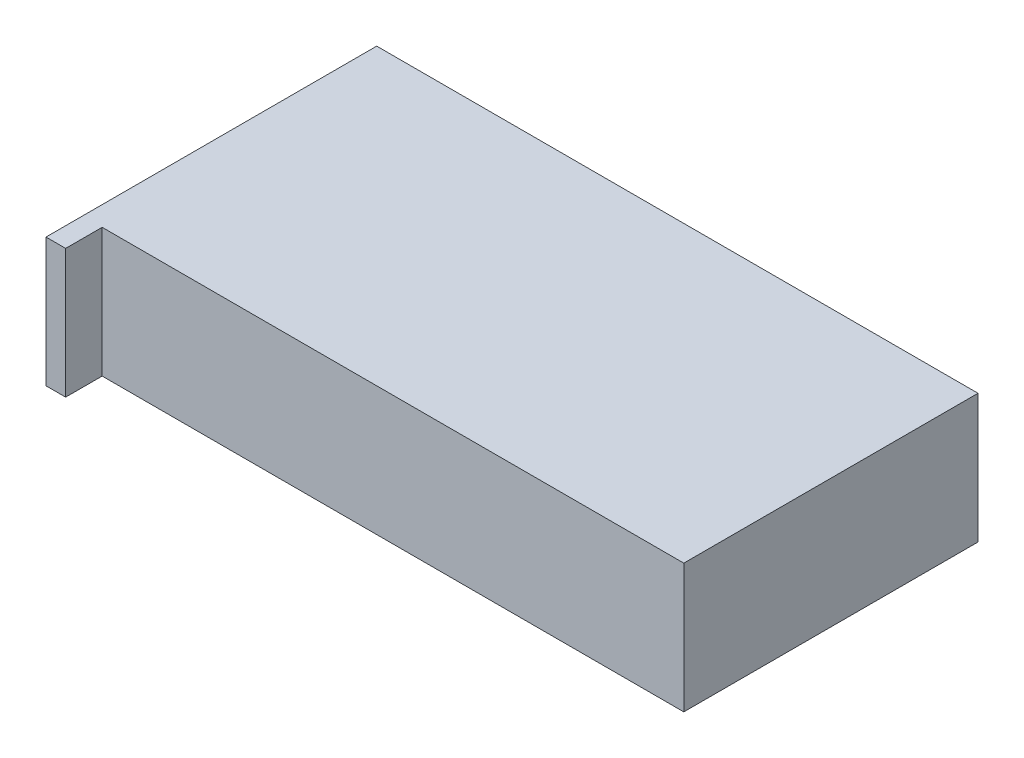
ISO-10303-21;
HEADER;
FILE_DESCRIPTION(('STEP AP214'),'2;1');
FILE_NAME('part.step','',(''),(''),'','','');
FILE_SCHEMA(('AUTOMOTIVE_DESIGN { 1 0 10303 214 1 1 1 1 }'));
ENDSEC;
DATA;
#1=APPLICATION_CONTEXT('core data for automotive mechanical design processes');
#2=APPLICATION_PROTOCOL_DEFINITION('international standard','automotive_design',2000,#1);
#3=PRODUCT_CONTEXT('',#1,'mechanical');
#4=PRODUCT('Part','Part','',(#3));
#5=PRODUCT_RELATED_PRODUCT_CATEGORY('part','',(#4));
#6=PRODUCT_DEFINITION_FORMATION('','',#4);
#7=PRODUCT_DEFINITION_CONTEXT('part definition',#1,'design');
#8=PRODUCT_DEFINITION('design','',#6,#7);
#9=PRODUCT_DEFINITION_SHAPE('','',#8);
#10=(LENGTH_UNIT() NAMED_UNIT(*) SI_UNIT(.MILLI.,.METRE.));
#11=(NAMED_UNIT(*) PLANE_ANGLE_UNIT() SI_UNIT($,.RADIAN.));
#12=(NAMED_UNIT(*) SI_UNIT($,.STERADIAN.) SOLID_ANGLE_UNIT());
#13=UNCERTAINTY_MEASURE_WITH_UNIT(LENGTH_MEASURE(1.E-05),#10,'distance_accuracy_value','');
#14=(GEOMETRIC_REPRESENTATION_CONTEXT(3) GLOBAL_UNCERTAINTY_ASSIGNED_CONTEXT((#13)) GLOBAL_UNIT_ASSIGNED_CONTEXT((#10,
#11,#12)) REPRESENTATION_CONTEXT('',''));
#15=CARTESIAN_POINT('',(0.,0.,0.));
#16=DIRECTION('',(0.,0.,1.));
#17=DIRECTION('',(1.,0.,0.));
#18=AXIS2_PLACEMENT_3D('',#15,#16,#17);
#19=CARTESIAN_POINT('',(0.,15.24,0.));
#20=DIRECTION('',(0.,0.,-1.));
#21=DIRECTION('',(-1.,0.,0.));
#22=AXIS2_PLACEMENT_3D('',#19,#20,#21);
#23=PLANE('',#22);
#24=DIRECTION('',(0.,1.,0.));
#25=VECTOR('',#24,1.);
#26=CARTESIAN_POINT('',(2.32433983399926,15.24,0.));
#27=LINE('',#26,#25);
#28=CARTESIAN_POINT('',(2.32433983399926,0.,0.));
#29=VERTEX_POINT('',#28);
#30=CARTESIAN_POINT('',(2.32433983399926,15.24,0.));
#31=VERTEX_POINT('',#30);
#32=EDGE_CURVE('E49',#29,#31,#27,.T.);
#33=ORIENTED_EDGE('',*,*,#32,.F.);
#34=DIRECTION('',(1.,0.,0.));
#35=VECTOR('',#34,1.);
#36=CARTESIAN_POINT('',(0.,0.,0.));
#37=LINE('',#36,#35);
#38=CARTESIAN_POINT('',(71.12,0.,0.));
#39=VERTEX_POINT('',#38);
#40=EDGE_CURVE('E102',#29,#39,#37,.T.);
#41=ORIENTED_EDGE('',*,*,#40,.T.);
#42=DIRECTION('',(0.,-1.,0.));
#43=VECTOR('',#42,1.);
#44=CARTESIAN_POINT('',(71.12,15.24,0.));
#45=LINE('',#44,#43);
#46=CARTESIAN_POINT('',(71.12,15.24,0.));
#47=VERTEX_POINT('',#46);
#48=EDGE_CURVE('E11',#47,#39,#45,.T.);
#49=ORIENTED_EDGE('',*,*,#48,.F.);
#50=DIRECTION('',(1.,0.,0.));
#51=VECTOR('',#50,1.);
#52=CARTESIAN_POINT('',(0.,15.24,0.));
#53=LINE('',#52,#51);
#54=EDGE_CURVE('E78',#31,#47,#53,.T.);
#55=ORIENTED_EDGE('',*,*,#54,.F.);
#56=EDGE_LOOP('',(#33,#41,#49,#55));
#57=FACE_BOUND('',#56,.T.);
#58=ADVANCED_FACE('F34',(#57),#23,.F.);
#59=CARTESIAN_POINT('',(0.,15.24,0.));
#60=DIRECTION('',(1.,0.,0.));
#61=DIRECTION('',(0.,0.,-1.));
#62=AXIS2_PLACEMENT_3D('',#59,#60,#61);
#63=PLANE('',#62);
#64=DIRECTION('',(0.,0.,1.));
#65=VECTOR('',#64,1.);
#66=CARTESIAN_POINT('',(0.,0.,0.));
#67=LINE('',#66,#65);
#68=CARTESIAN_POINT('',(0.,0.,-34.798));
#69=VERTEX_POINT('',#68);
#70=CARTESIAN_POINT('',(0.,0.,4.31799999999999));
#71=VERTEX_POINT('',#70);
#72=EDGE_CURVE('E95',#69,#71,#67,.T.);
#73=ORIENTED_EDGE('',*,*,#72,.T.);
#74=DIRECTION('',(0.,-1.,0.));
#75=VECTOR('',#74,1.);
#76=CARTESIAN_POINT('',(0.,15.24,4.31799999999999));
#77=LINE('',#76,#75);
#78=CARTESIAN_POINT('',(0.,15.24,4.31799999999999));
#79=VERTEX_POINT('',#78);
#80=EDGE_CURVE('E99',#79,#71,#77,.T.);
#81=ORIENTED_EDGE('',*,*,#80,.F.);
#82=DIRECTION('',(0.,0.,1.));
#83=VECTOR('',#82,1.);
#84=CARTESIAN_POINT('',(0.,15.24,0.));
#85=LINE('',#84,#83);
#86=CARTESIAN_POINT('',(0.,15.24,-34.798));
#87=VERTEX_POINT('',#86);
#88=EDGE_CURVE('E125',#87,#79,#85,.T.);
#89=ORIENTED_EDGE('',*,*,#88,.F.);
#90=DIRECTION('',(0.,-1.,0.));
#91=VECTOR('',#90,1.);
#92=CARTESIAN_POINT('',(0.,15.24,-34.798));
#93=LINE('',#92,#91);
#94=EDGE_CURVE('E100',#87,#69,#93,.T.);
#95=ORIENTED_EDGE('',*,*,#94,.T.);
#96=EDGE_LOOP('',(#73,#81,#89,#95));
#97=FACE_BOUND('',#96,.T.);
#98=ADVANCED_FACE('F36',(#97),#63,.F.);
#99=CARTESIAN_POINT('',(71.12,15.24,0.));
#100=DIRECTION('',(-1.,0.,0.));
#101=DIRECTION('',(0.,0.,1.));
#102=AXIS2_PLACEMENT_3D('',#99,#100,#101);
#103=PLANE('',#102);
#104=DIRECTION('',(0.,0.,-1.));
#105=VECTOR('',#104,1.);
#106=CARTESIAN_POINT('',(71.12,0.,0.));
#107=LINE('',#106,#105);
#108=CARTESIAN_POINT('',(71.12,0.,-34.798));
#109=VERTEX_POINT('',#108);
#110=EDGE_CURVE('E132',#39,#109,#107,.T.);
#111=ORIENTED_EDGE('',*,*,#110,.T.);
#112=DIRECTION('',(0.,-1.,0.));
#113=VECTOR('',#112,1.);
#114=CARTESIAN_POINT('',(71.12,15.24,-34.798));
#115=LINE('',#114,#113);
#116=CARTESIAN_POINT('',(71.12,15.24,-34.798));
#117=VERTEX_POINT('',#116);
#118=EDGE_CURVE('E42',#117,#109,#115,.T.);
#119=ORIENTED_EDGE('',*,*,#118,.F.);
#120=DIRECTION('',(0.,0.,-1.));
#121=VECTOR('',#120,1.);
#122=CARTESIAN_POINT('',(71.12,15.24,0.));
#123=LINE('',#122,#121);
#124=EDGE_CURVE('E128',#47,#117,#123,.T.);
#125=ORIENTED_EDGE('',*,*,#124,.F.);
#126=ORIENTED_EDGE('',*,*,#48,.T.);
#127=EDGE_LOOP('',(#111,#119,#125,#126));
#128=FACE_BOUND('',#127,.T.);
#129=ADVANCED_FACE('F140',(#128),#103,.F.);
#130=CARTESIAN_POINT('',(0.,15.24,-34.798));
#131=DIRECTION('',(0.,0.,1.));
#132=DIRECTION('',(1.,0.,0.));
#133=AXIS2_PLACEMENT_3D('',#130,#131,#132);
#134=PLANE('',#133);
#135=DIRECTION('',(-1.,0.,0.));
#136=VECTOR('',#135,1.);
#137=CARTESIAN_POINT('',(0.,0.,-34.798));
#138=LINE('',#137,#136);
#139=EDGE_CURVE('E74',#109,#69,#138,.T.);
#140=ORIENTED_EDGE('',*,*,#139,.T.);
#141=ORIENTED_EDGE('',*,*,#94,.F.);
#142=DIRECTION('',(-1.,0.,0.));
#143=VECTOR('',#142,1.);
#144=CARTESIAN_POINT('',(0.,15.24,-34.798));
#145=LINE('',#144,#143);
#146=EDGE_CURVE('E58',#117,#87,#145,.T.);
#147=ORIENTED_EDGE('',*,*,#146,.F.);
#148=ORIENTED_EDGE('',*,*,#118,.T.);
#149=EDGE_LOOP('',(#140,#141,#147,#148));
#150=FACE_BOUND('',#149,.T.);
#151=ADVANCED_FACE('F136',(#150),#134,.F.);
#152=CARTESIAN_POINT('',(0.,15.24,0.));
#153=DIRECTION('',(0.,-1.,0.));
#154=DIRECTION('',(0.,0.,-1.));
#155=AXIS2_PLACEMENT_3D('',#152,#153,#154);
#156=PLANE('',#155);
#157=ORIENTED_EDGE('',*,*,#88,.T.);
#158=DIRECTION('',(-1.,0.,0.));
#159=VECTOR('',#158,1.);
#160=CARTESIAN_POINT('',(0.,15.24,4.31799999999999));
#161=LINE('',#160,#159);
#162=CARTESIAN_POINT('',(2.32433983399926,15.24,4.31799999999999));
#163=VERTEX_POINT('',#162);
#164=EDGE_CURVE('E116',#163,#79,#161,.T.);
#165=ORIENTED_EDGE('',*,*,#164,.F.);
#166=DIRECTION('',(0.,0.,-1.));
#167=VECTOR('',#166,1.);
#168=CARTESIAN_POINT('',(2.32433983399926,15.24,4.31799999999999));
#169=LINE('',#168,#167);
#170=EDGE_CURVE('E121',#163,#31,#169,.T.);
#171=ORIENTED_EDGE('',*,*,#170,.T.);
#172=ORIENTED_EDGE('',*,*,#54,.T.);
#173=ORIENTED_EDGE('',*,*,#124,.T.);
#174=ORIENTED_EDGE('',*,*,#146,.T.);
#175=EDGE_LOOP('',(#157,#165,#171,#172,#173,#174));
#176=FACE_BOUND('',#175,.T.);
#177=ADVANCED_FACE('F144',(#176),#156,.F.);
#178=CARTESIAN_POINT('',(0.,0.,0.));
#179=DIRECTION('',(0.,-1.,0.));
#180=DIRECTION('',(0.,0.,-1.));
#181=AXIS2_PLACEMENT_3D('',#178,#179,#180);
#182=PLANE('',#181);
#183=ORIENTED_EDGE('',*,*,#72,.F.);
#184=ORIENTED_EDGE('',*,*,#139,.F.);
#185=ORIENTED_EDGE('',*,*,#110,.F.);
#186=ORIENTED_EDGE('',*,*,#40,.F.);
#187=DIRECTION('',(0.,0.,-1.));
#188=VECTOR('',#187,1.);
#189=CARTESIAN_POINT('',(2.32433983399926,0.,4.31799999999999));
#190=LINE('',#189,#188);
#191=CARTESIAN_POINT('',(2.32433983399926,0.,4.31799999999999));
#192=VERTEX_POINT('',#191);
#193=EDGE_CURVE('E103',#192,#29,#190,.T.);
#194=ORIENTED_EDGE('',*,*,#193,.F.);
#195=DIRECTION('',(1.,0.,0.));
#196=VECTOR('',#195,1.);
#197=CARTESIAN_POINT('',(0.,0.,4.31799999999999));
#198=LINE('',#197,#196);
#199=EDGE_CURVE('E106',#71,#192,#198,.T.);
#200=ORIENTED_EDGE('',*,*,#199,.F.);
#201=EDGE_LOOP('',(#183,#184,#185,#186,#194,#200));
#202=FACE_BOUND('',#201,.T.);
#203=ADVANCED_FACE('F107',(#202),#182,.T.);
#204=CARTESIAN_POINT('',(2.32433983399926,15.24,4.31799999999999));
#205=DIRECTION('',(-1.,0.,0.));
#206=DIRECTION('',(0.,0.,1.));
#207=AXIS2_PLACEMENT_3D('',#204,#205,#206);
#208=PLANE('',#207);
#209=ORIENTED_EDGE('',*,*,#32,.T.);
#210=ORIENTED_EDGE('',*,*,#170,.F.);
#211=DIRECTION('',(0.,1.,0.));
#212=VECTOR('',#211,1.);
#213=CARTESIAN_POINT('',(2.32433983399926,15.24,4.31799999999999));
#214=LINE('',#213,#212);
#215=EDGE_CURVE('E111',#192,#163,#214,.T.);
#216=ORIENTED_EDGE('',*,*,#215,.F.);
#217=ORIENTED_EDGE('',*,*,#193,.T.);
#218=EDGE_LOOP('',(#209,#210,#216,#217));
#219=FACE_BOUND('',#218,.T.);
#220=ADVANCED_FACE('F143',(#219),#208,.F.);
#221=CARTESIAN_POINT('',(0.,0.,4.31799999999999));
#222=DIRECTION('',(0.,0.,1.));
#223=DIRECTION('',(1.,0.,0.));
#224=AXIS2_PLACEMENT_3D('',#221,#222,#223);
#225=PLANE('',#224);
#226=ORIENTED_EDGE('',*,*,#80,.T.);
#227=ORIENTED_EDGE('',*,*,#199,.T.);
#228=ORIENTED_EDGE('',*,*,#215,.T.);
#229=ORIENTED_EDGE('',*,*,#164,.T.);
#230=EDGE_LOOP('',(#226,#227,#228,#229));
#231=FACE_BOUND('',#230,.T.);
#232=ADVANCED_FACE('F114',(#231),#225,.T.);
#233=CLOSED_SHELL('',(#58,#98,#129,#151,#177,#203,#220,#232));
#234=MANIFOLD_SOLID_BREP('B2',#233);
#235=ADVANCED_BREP_SHAPE_REPRESENTATION('',(#18,#234),#14);
#236=SHAPE_DEFINITION_REPRESENTATION(#9,#235);
ENDSEC;
END-ISO-10303-21;
